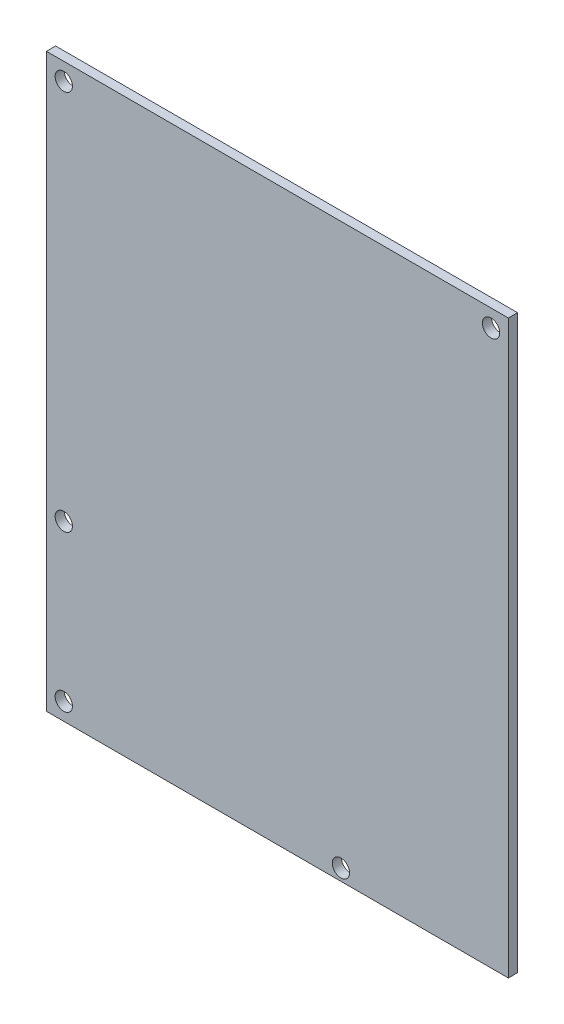
ISO-10303-21;
HEADER;
FILE_DESCRIPTION(('STEP AP214'),'2;1');
FILE_NAME('part.step','',(''),(''),'','','');
FILE_SCHEMA(('AUTOMOTIVE_DESIGN { 1 0 10303 214 1 1 1 1 }'));
ENDSEC;
DATA;
#1=APPLICATION_CONTEXT('core data for automotive mechanical design processes');
#2=APPLICATION_PROTOCOL_DEFINITION('international standard','automotive_design',2000,#1);
#3=PRODUCT_CONTEXT('',#1,'mechanical');
#4=PRODUCT('Part','Part','',(#3));
#5=PRODUCT_RELATED_PRODUCT_CATEGORY('part','',(#4));
#6=PRODUCT_DEFINITION_FORMATION('','',#4);
#7=PRODUCT_DEFINITION_CONTEXT('part definition',#1,'design');
#8=PRODUCT_DEFINITION('design','',#6,#7);
#9=PRODUCT_DEFINITION_SHAPE('','',#8);
#10=(LENGTH_UNIT() NAMED_UNIT(*) SI_UNIT(.MILLI.,.METRE.));
#11=(NAMED_UNIT(*) PLANE_ANGLE_UNIT() SI_UNIT($,.RADIAN.));
#12=(NAMED_UNIT(*) SI_UNIT($,.STERADIAN.) SOLID_ANGLE_UNIT());
#13=UNCERTAINTY_MEASURE_WITH_UNIT(LENGTH_MEASURE(1.E-05),#10,'distance_accuracy_value','');
#14=(GEOMETRIC_REPRESENTATION_CONTEXT(3) GLOBAL_UNCERTAINTY_ASSIGNED_CONTEXT((#13)) GLOBAL_UNIT_ASSIGNED_CONTEXT((#10,
#11,#12)) REPRESENTATION_CONTEXT('',''));
#15=CARTESIAN_POINT('',(0.,0.,0.));
#16=DIRECTION('',(0.,0.,1.));
#17=DIRECTION('',(1.,0.,0.));
#18=AXIS2_PLACEMENT_3D('',#15,#16,#17);
#19=CARTESIAN_POINT('',(0.,0.,-1.59143954));
#20=DIRECTION('',(0.,1.,0.));
#21=DIRECTION('',(1.,0.,0.));
#22=AXIS2_PLACEMENT_3D('',#19,#20,#21);
#23=PLANE('',#22);
#24=DIRECTION('',(1.,0.,0.));
#25=VECTOR('',#24,1.);
#26=CARTESIAN_POINT('',(0.,0.,0.));
#27=LINE('',#26,#25);
#28=CARTESIAN_POINT('',(0.,0.,0.));
#29=VERTEX_POINT('',#28);
#30=CARTESIAN_POINT('',(80.,0.,0.));
#31=VERTEX_POINT('',#30);
#32=EDGE_CURVE('E11',#29,#31,#27,.T.);
#33=ORIENTED_EDGE('',*,*,#32,.F.);
#34=DIRECTION('',(0.,0.,1.));
#35=VECTOR('',#34,1.);
#36=CARTESIAN_POINT('',(0.,0.,-1.59143954));
#37=LINE('',#36,#35);
#38=CARTESIAN_POINT('',(0.,0.,-1.59143954));
#39=VERTEX_POINT('',#38);
#40=EDGE_CURVE('E24',#39,#29,#37,.T.);
#41=ORIENTED_EDGE('',*,*,#40,.F.);
#42=DIRECTION('',(1.,0.,0.));
#43=VECTOR('',#42,1.);
#44=CARTESIAN_POINT('',(0.,0.,-1.59143954));
#45=LINE('',#44,#43);
#46=CARTESIAN_POINT('',(80.,0.,-1.59143954));
#47=VERTEX_POINT('',#46);
#48=EDGE_CURVE('E155',#39,#47,#45,.T.);
#49=ORIENTED_EDGE('',*,*,#48,.T.);
#50=DIRECTION('',(0.,0.,1.));
#51=VECTOR('',#50,1.);
#52=CARTESIAN_POINT('',(80.,0.,-1.59143954));
#53=LINE('',#52,#51);
#54=EDGE_CURVE('E37',#47,#31,#53,.T.);
#55=ORIENTED_EDGE('',*,*,#54,.T.);
#56=EDGE_LOOP('',(#33,#41,#49,#55));
#57=FACE_BOUND('',#56,.T.);
#58=ADVANCED_FACE('F17',(#57),#23,.F.);
#59=CARTESIAN_POINT('',(80.,0.,-1.59143954));
#60=DIRECTION('',(-1.,0.,0.));
#61=DIRECTION('',(0.,1.,0.));
#62=AXIS2_PLACEMENT_3D('',#59,#60,#61);
#63=PLANE('',#62);
#64=DIRECTION('',(0.,1.,0.));
#65=VECTOR('',#64,1.);
#66=CARTESIAN_POINT('',(80.,0.,0.));
#67=LINE('',#66,#65);
#68=CARTESIAN_POINT('',(80.,99.,0.));
#69=VERTEX_POINT('',#68);
#70=EDGE_CURVE('E151',#31,#69,#67,.T.);
#71=ORIENTED_EDGE('',*,*,#70,.F.);
#72=ORIENTED_EDGE('',*,*,#54,.F.);
#73=DIRECTION('',(0.,1.,0.));
#74=VECTOR('',#73,1.);
#75=CARTESIAN_POINT('',(80.,0.,-1.59143954));
#76=LINE('',#75,#74);
#77=CARTESIAN_POINT('',(80.,99.,-1.59143954));
#78=VERTEX_POINT('',#77);
#79=EDGE_CURVE('E148',#47,#78,#76,.T.);
#80=ORIENTED_EDGE('',*,*,#79,.T.);
#81=DIRECTION('',(0.,0.,1.));
#82=VECTOR('',#81,1.);
#83=CARTESIAN_POINT('',(80.,99.,-1.59143954));
#84=LINE('',#83,#82);
#85=EDGE_CURVE('E146',#78,#69,#84,.T.);
#86=ORIENTED_EDGE('',*,*,#85,.T.);
#87=EDGE_LOOP('',(#71,#72,#80,#86));
#88=FACE_BOUND('',#87,.T.);
#89=ADVANCED_FACE('F164',(#88),#63,.F.);
#90=CARTESIAN_POINT('',(80.,99.,-1.59143954));
#91=DIRECTION('',(0.,-1.,0.));
#92=DIRECTION('',(-1.,0.,0.));
#93=AXIS2_PLACEMENT_3D('',#90,#91,#92);
#94=PLANE('',#93);
#95=DIRECTION('',(-1.,0.,0.));
#96=VECTOR('',#95,1.);
#97=CARTESIAN_POINT('',(80.,99.,0.));
#98=LINE('',#97,#96);
#99=CARTESIAN_POINT('',(0.,99.,0.));
#100=VERTEX_POINT('',#99);
#101=EDGE_CURVE('E143',#69,#100,#98,.T.);
#102=ORIENTED_EDGE('',*,*,#101,.F.);
#103=ORIENTED_EDGE('',*,*,#85,.F.);
#104=DIRECTION('',(-1.,0.,0.));
#105=VECTOR('',#104,1.);
#106=CARTESIAN_POINT('',(80.,99.,-1.59143954));
#107=LINE('',#106,#105);
#108=CARTESIAN_POINT('',(0.,99.,-1.59143954));
#109=VERTEX_POINT('',#108);
#110=EDGE_CURVE('E140',#78,#109,#107,.T.);
#111=ORIENTED_EDGE('',*,*,#110,.T.);
#112=DIRECTION('',(0.,0.,1.));
#113=VECTOR('',#112,1.);
#114=CARTESIAN_POINT('',(0.,99.,-1.59143954));
#115=LINE('',#114,#113);
#116=EDGE_CURVE('E138',#109,#100,#115,.T.);
#117=ORIENTED_EDGE('',*,*,#116,.T.);
#118=EDGE_LOOP('',(#102,#103,#111,#117));
#119=FACE_BOUND('',#118,.T.);
#120=ADVANCED_FACE('F170',(#119),#94,.F.);
#121=CARTESIAN_POINT('',(0.,99.,-1.59143954));
#122=DIRECTION('',(1.,0.,0.));
#123=DIRECTION('',(0.,-1.,0.));
#124=AXIS2_PLACEMENT_3D('',#121,#122,#123);
#125=PLANE('',#124);
#126=DIRECTION('',(0.,-1.,0.));
#127=VECTOR('',#126,1.);
#128=CARTESIAN_POINT('',(0.,99.,0.));
#129=LINE('',#128,#127);
#130=EDGE_CURVE('E135',#100,#29,#129,.T.);
#131=ORIENTED_EDGE('',*,*,#130,.F.);
#132=ORIENTED_EDGE('',*,*,#116,.F.);
#133=DIRECTION('',(0.,-1.,0.));
#134=VECTOR('',#133,1.);
#135=CARTESIAN_POINT('',(0.,99.,-1.59143954));
#136=LINE('',#135,#134);
#137=EDGE_CURVE('E133',#109,#39,#136,.T.);
#138=ORIENTED_EDGE('',*,*,#137,.T.);
#139=ORIENTED_EDGE('',*,*,#40,.T.);
#140=EDGE_LOOP('',(#131,#132,#138,#139));
#141=FACE_BOUND('',#140,.T.);
#142=ADVANCED_FACE('F171',(#141),#125,.F.);
#143=CARTESIAN_POINT('',(2.99999908,30.00000096,-1.59143954));
#144=DIRECTION('',(0.,0.,-1.));
#145=DIRECTION('',(1.,0.,0.));
#146=AXIS2_PLACEMENT_3D('',#143,#144,#145);
#147=CYLINDRICAL_SURFACE('',#146,1.49999954);
#148=DIRECTION('',(0.,0.,1.));
#149=VECTOR('',#148,1.);
#150=CARTESIAN_POINT('',(4.49999862,30.00000096,-1.59143954));
#151=LINE('',#150,#149);
#152=CARTESIAN_POINT('',(4.49999862,30.00000096,-1.59143954));
#153=VERTEX_POINT('',#152);
#154=CARTESIAN_POINT('',(4.49999862,30.00000096,0.));
#155=VERTEX_POINT('',#154);
#156=EDGE_CURVE('E131',#153,#155,#151,.T.);
#157=ORIENTED_EDGE('',*,*,#156,.T.);
#158=CARTESIAN_POINT('',(2.99999908,30.00000096,0.));
#159=DIRECTION('',(0.,0.,1.));
#160=DIRECTION('',(1.,0.,0.));
#161=AXIS2_PLACEMENT_3D('',#158,#159,#160);
#162=CIRCLE('',#161,1.49999954);
#163=EDGE_CURVE('E128',#155,#155,#162,.T.);
#164=ORIENTED_EDGE('',*,*,#163,.T.);
#165=ORIENTED_EDGE('',*,*,#156,.F.);
#166=CARTESIAN_POINT('',(2.99999908,30.00000096,-1.59143954));
#167=DIRECTION('',(0.,0.,1.));
#168=DIRECTION('',(1.,0.,0.));
#169=AXIS2_PLACEMENT_3D('',#166,#167,#168);
#170=CIRCLE('',#169,1.49999954);
#171=EDGE_CURVE('E124',#153,#153,#170,.T.);
#172=ORIENTED_EDGE('',*,*,#171,.F.);
#173=EDGE_LOOP('',(#157,#164,#165,#172));
#174=FACE_BOUND('',#173,.T.);
#175=ADVANCED_FACE('F173',(#174),#147,.F.);
#176=CARTESIAN_POINT('',(2.99999908,96.00000104,-1.59143954));
#177=DIRECTION('',(0.,0.,-1.));
#178=DIRECTION('',(1.,0.,0.));
#179=AXIS2_PLACEMENT_3D('',#176,#177,#178);
#180=CYLINDRICAL_SURFACE('',#179,1.49999954);
#181=DIRECTION('',(0.,0.,1.));
#182=VECTOR('',#181,1.);
#183=CARTESIAN_POINT('',(4.49999862,96.00000104,-1.59143954));
#184=LINE('',#183,#182);
#185=CARTESIAN_POINT('',(4.49999862,96.00000104,-1.59143954));
#186=VERTEX_POINT('',#185);
#187=CARTESIAN_POINT('',(4.49999862,96.00000104,0.));
#188=VERTEX_POINT('',#187);
#189=EDGE_CURVE('E122',#186,#188,#184,.T.);
#190=ORIENTED_EDGE('',*,*,#189,.T.);
#191=CARTESIAN_POINT('',(2.99999908,96.00000104,0.));
#192=DIRECTION('',(0.,0.,1.));
#193=DIRECTION('',(1.,0.,0.));
#194=AXIS2_PLACEMENT_3D('',#191,#192,#193);
#195=CIRCLE('',#194,1.49999954);
#196=EDGE_CURVE('E119',#188,#188,#195,.T.);
#197=ORIENTED_EDGE('',*,*,#196,.T.);
#198=ORIENTED_EDGE('',*,*,#189,.F.);
#199=CARTESIAN_POINT('',(2.99999908,96.00000104,-1.59143954));
#200=DIRECTION('',(0.,0.,1.));
#201=DIRECTION('',(1.,0.,0.));
#202=AXIS2_PLACEMENT_3D('',#199,#200,#201);
#203=CIRCLE('',#202,1.49999954);
#204=EDGE_CURVE('E116',#186,#186,#203,.T.);
#205=ORIENTED_EDGE('',*,*,#204,.F.);
#206=EDGE_LOOP('',(#190,#197,#198,#205));
#207=FACE_BOUND('',#206,.T.);
#208=ADVANCED_FACE('F180',(#207),#180,.F.);
#209=CARTESIAN_POINT('',(50.9999996,2.00000108,-1.59143954));
#210=DIRECTION('',(0.,0.,-1.));
#211=DIRECTION('',(1.,0.,0.));
#212=AXIS2_PLACEMENT_3D('',#209,#210,#211);
#213=CYLINDRICAL_SURFACE('',#212,1.49999954);
#214=DIRECTION('',(0.,0.,1.));
#215=VECTOR('',#214,1.);
#216=CARTESIAN_POINT('',(52.49999914,2.00000108,-1.59143954));
#217=LINE('',#216,#215);
#218=CARTESIAN_POINT('',(52.49999914,2.00000108,-1.59143954));
#219=VERTEX_POINT('',#218);
#220=CARTESIAN_POINT('',(52.49999914,2.00000108,0.));
#221=VERTEX_POINT('',#220);
#222=EDGE_CURVE('E114',#219,#221,#217,.T.);
#223=ORIENTED_EDGE('',*,*,#222,.T.);
#224=CARTESIAN_POINT('',(50.9999996,2.00000108,0.));
#225=DIRECTION('',(0.,0.,1.));
#226=DIRECTION('',(1.,0.,0.));
#227=AXIS2_PLACEMENT_3D('',#224,#225,#226);
#228=CIRCLE('',#227,1.49999954);
#229=EDGE_CURVE('E111',#221,#221,#228,.T.);
#230=ORIENTED_EDGE('',*,*,#229,.T.);
#231=ORIENTED_EDGE('',*,*,#222,.F.);
#232=CARTESIAN_POINT('',(50.9999996,2.00000108,-1.59143954));
#233=DIRECTION('',(0.,0.,1.));
#234=DIRECTION('',(1.,0.,0.));
#235=AXIS2_PLACEMENT_3D('',#232,#233,#234);
#236=CIRCLE('',#235,1.49999954);
#237=EDGE_CURVE('E107',#219,#219,#236,.T.);
#238=ORIENTED_EDGE('',*,*,#237,.F.);
#239=EDGE_LOOP('',(#223,#230,#231,#238));
#240=FACE_BOUND('',#239,.T.);
#241=ADVANCED_FACE('F221',(#240),#213,.F.);
#242=CARTESIAN_POINT('',(2.99999908,2.99999908,-1.59143954));
#243=DIRECTION('',(0.,0.,-1.));
#244=DIRECTION('',(1.,0.,0.));
#245=AXIS2_PLACEMENT_3D('',#242,#243,#244);
#246=CYLINDRICAL_SURFACE('',#245,1.49999954);
#247=DIRECTION('',(0.,0.,1.));
#248=VECTOR('',#247,1.);
#249=CARTESIAN_POINT('',(4.49999862,2.99999908,-1.59143954));
#250=LINE('',#249,#248);
#251=CARTESIAN_POINT('',(4.49999862,2.99999908,-1.59143954));
#252=VERTEX_POINT('',#251);
#253=CARTESIAN_POINT('',(4.49999862,2.99999908,0.));
#254=VERTEX_POINT('',#253);
#255=EDGE_CURVE('E105',#252,#254,#250,.T.);
#256=ORIENTED_EDGE('',*,*,#255,.T.);
#257=CARTESIAN_POINT('',(2.99999908,2.99999908,0.));
#258=DIRECTION('',(0.,0.,1.));
#259=DIRECTION('',(1.,0.,0.));
#260=AXIS2_PLACEMENT_3D('',#257,#258,#259);
#261=CIRCLE('',#260,1.49999954);
#262=EDGE_CURVE('E102',#254,#254,#261,.T.);
#263=ORIENTED_EDGE('',*,*,#262,.T.);
#264=ORIENTED_EDGE('',*,*,#255,.F.);
#265=CARTESIAN_POINT('',(2.99999908,2.99999908,-1.59143954));
#266=DIRECTION('',(0.,0.,1.));
#267=DIRECTION('',(1.,0.,0.));
#268=AXIS2_PLACEMENT_3D('',#265,#266,#267);
#269=CIRCLE('',#268,1.49999954);
#270=EDGE_CURVE('E92',#252,#252,#269,.T.);
#271=ORIENTED_EDGE('',*,*,#270,.F.);
#272=EDGE_LOOP('',(#256,#263,#264,#271));
#273=FACE_BOUND('',#272,.T.);
#274=ADVANCED_FACE('F231',(#273),#246,.F.);
#275=CARTESIAN_POINT('',(77.00000094,96.00000104,-1.59143954));
#276=DIRECTION('',(0.,0.,-1.));
#277=DIRECTION('',(1.,0.,0.));
#278=AXIS2_PLACEMENT_3D('',#275,#276,#277);
#279=CYLINDRICAL_SURFACE('',#278,1.49999954);
#280=DIRECTION('',(0.,0.,1.));
#281=VECTOR('',#280,1.);
#282=CARTESIAN_POINT('',(78.50000048,96.00000104,-1.59143954));
#283=LINE('',#282,#281);
#284=CARTESIAN_POINT('',(78.50000048,96.00000104,-1.59143954));
#285=VERTEX_POINT('',#284);
#286=CARTESIAN_POINT('',(78.50000048,96.00000104,0.));
#287=VERTEX_POINT('',#286);
#288=EDGE_CURVE('E86',#285,#287,#283,.T.);
#289=ORIENTED_EDGE('',*,*,#288,.T.);
#290=CARTESIAN_POINT('',(77.00000094,96.00000104,0.));
#291=DIRECTION('',(0.,0.,1.));
#292=DIRECTION('',(1.,0.,0.));
#293=AXIS2_PLACEMENT_3D('',#290,#291,#292);
#294=CIRCLE('',#293,1.49999954);
#295=EDGE_CURVE('E91',#287,#287,#294,.T.);
#296=ORIENTED_EDGE('',*,*,#295,.T.);
#297=ORIENTED_EDGE('',*,*,#288,.F.);
#298=CARTESIAN_POINT('',(77.00000094,96.00000104,-1.59143954));
#299=DIRECTION('',(0.,0.,1.));
#300=DIRECTION('',(1.,0.,0.));
#301=AXIS2_PLACEMENT_3D('',#298,#299,#300);
#302=CIRCLE('',#301,1.49999954);
#303=EDGE_CURVE('E89',#285,#285,#302,.T.);
#304=ORIENTED_EDGE('',*,*,#303,.F.);
#305=EDGE_LOOP('',(#289,#296,#297,#304));
#306=FACE_BOUND('',#305,.T.);
#307=ADVANCED_FACE('F88',(#306),#279,.F.);
#308=CARTESIAN_POINT('',(0.,0.,-1.59143954));
#309=DIRECTION('',(0.,0.,-1.));
#310=DIRECTION('',(-1.,0.,0.));
#311=AXIS2_PLACEMENT_3D('',#308,#309,#310);
#312=PLANE('',#311);
#313=ORIENTED_EDGE('',*,*,#137,.F.);
#314=ORIENTED_EDGE('',*,*,#110,.F.);
#315=ORIENTED_EDGE('',*,*,#79,.F.);
#316=ORIENTED_EDGE('',*,*,#48,.F.);
#317=EDGE_LOOP('',(#313,#314,#315,#316));
#318=FACE_BOUND('',#317,.T.);
#319=ORIENTED_EDGE('',*,*,#171,.T.);
#320=EDGE_LOOP('',(#319));
#321=FACE_BOUND('',#320,.T.);
#322=ORIENTED_EDGE('',*,*,#204,.T.);
#323=EDGE_LOOP('',(#322));
#324=FACE_BOUND('',#323,.T.);
#325=ORIENTED_EDGE('',*,*,#237,.T.);
#326=EDGE_LOOP('',(#325));
#327=FACE_BOUND('',#326,.T.);
#328=ORIENTED_EDGE('',*,*,#270,.T.);
#329=EDGE_LOOP('',(#328));
#330=FACE_BOUND('',#329,.T.);
#331=ORIENTED_EDGE('',*,*,#303,.T.);
#332=EDGE_LOOP('',(#331));
#333=FACE_BOUND('',#332,.T.);
#334=ADVANCED_FACE('F95',(#318,#321,#324,#327,#330,#333),#312,.T.);
#335=CARTESIAN_POINT('',(0.,0.,0.));
#336=DIRECTION('',(0.,0.,-1.));
#337=DIRECTION('',(-1.,0.,0.));
#338=AXIS2_PLACEMENT_3D('',#335,#336,#337);
#339=PLANE('',#338);
#340=ORIENTED_EDGE('',*,*,#32,.T.);
#341=ORIENTED_EDGE('',*,*,#70,.T.);
#342=ORIENTED_EDGE('',*,*,#101,.T.);
#343=ORIENTED_EDGE('',*,*,#130,.T.);
#344=EDGE_LOOP('',(#340,#341,#342,#343));
#345=FACE_BOUND('',#344,.T.);
#346=ORIENTED_EDGE('',*,*,#163,.F.);
#347=EDGE_LOOP('',(#346));
#348=FACE_BOUND('',#347,.T.);
#349=ORIENTED_EDGE('',*,*,#196,.F.);
#350=EDGE_LOOP('',(#349));
#351=FACE_BOUND('',#350,.T.);
#352=ORIENTED_EDGE('',*,*,#229,.F.);
#353=EDGE_LOOP('',(#352));
#354=FACE_BOUND('',#353,.T.);
#355=ORIENTED_EDGE('',*,*,#262,.F.);
#356=EDGE_LOOP('',(#355));
#357=FACE_BOUND('',#356,.T.);
#358=ORIENTED_EDGE('',*,*,#295,.F.);
#359=EDGE_LOOP('',(#358));
#360=FACE_BOUND('',#359,.T.);
#361=ADVANCED_FACE('F167',(#345,#348,#351,#354,#357,#360),#339,.F.);
#362=CLOSED_SHELL('',(#58,#89,#120,#142,#175,#208,#241,#274,#307,#334,#361));
#363=MANIFOLD_SOLID_BREP('B1',#362);
#364=ADVANCED_BREP_SHAPE_REPRESENTATION('',(#18,#363),#14);
#365=SHAPE_DEFINITION_REPRESENTATION(#9,#364);
ENDSEC;
END-ISO-10303-21;
